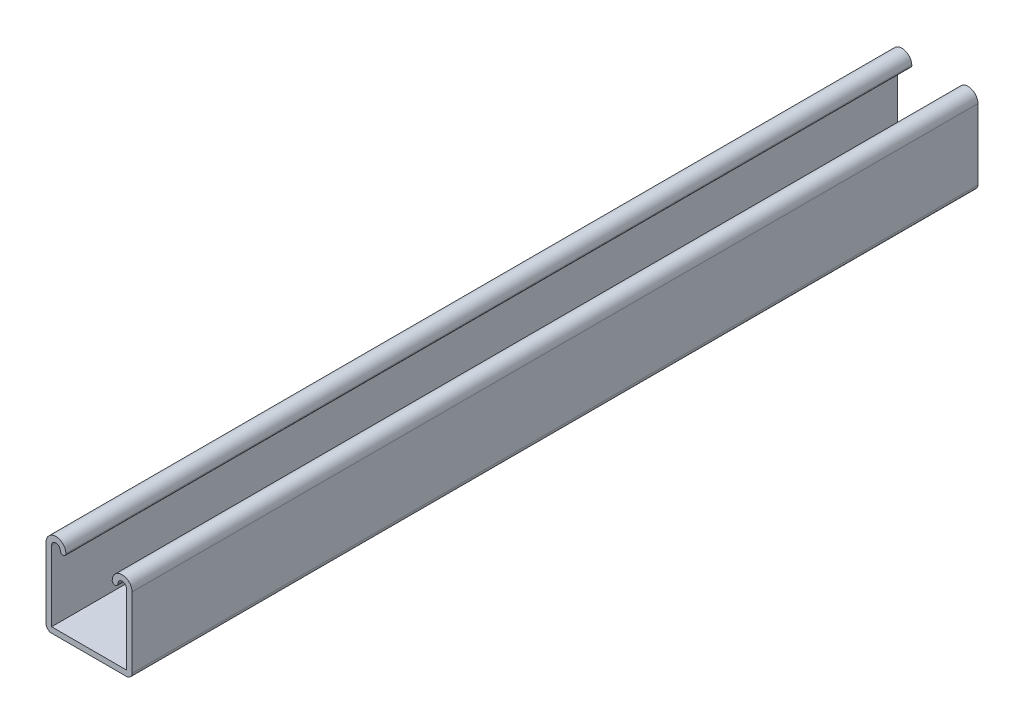
ISO-10303-21;
HEADER;
FILE_DESCRIPTION(('STEP AP214'),'2;1');
FILE_NAME('part.step','',(''),(''),'','','');
FILE_SCHEMA(('AUTOMOTIVE_DESIGN { 1 0 10303 214 1 1 1 1 }'));
ENDSEC;
DATA;
#1=APPLICATION_CONTEXT('core data for automotive mechanical design processes');
#2=APPLICATION_PROTOCOL_DEFINITION('international standard','automotive_design',2000,#1);
#3=PRODUCT_CONTEXT('',#1,'mechanical');
#4=PRODUCT('Part','Part','',(#3));
#5=PRODUCT_RELATED_PRODUCT_CATEGORY('part','',(#4));
#6=PRODUCT_DEFINITION_FORMATION('','',#4);
#7=PRODUCT_DEFINITION_CONTEXT('part definition',#1,'design');
#8=PRODUCT_DEFINITION('design','',#6,#7);
#9=PRODUCT_DEFINITION_SHAPE('','',#8);
#10=(LENGTH_UNIT() NAMED_UNIT(*) SI_UNIT(.MILLI.,.METRE.));
#11=(NAMED_UNIT(*) PLANE_ANGLE_UNIT() SI_UNIT($,.RADIAN.));
#12=(NAMED_UNIT(*) SI_UNIT($,.STERADIAN.) SOLID_ANGLE_UNIT());
#13=UNCERTAINTY_MEASURE_WITH_UNIT(LENGTH_MEASURE(1.E-05),#10,'distance_accuracy_value','');
#14=(GEOMETRIC_REPRESENTATION_CONTEXT(3) GLOBAL_UNCERTAINTY_ASSIGNED_CONTEXT((#13)) GLOBAL_UNIT_ASSIGNED_CONTEXT((#10,
#11,#12)) REPRESENTATION_CONTEXT('',''));
#15=CARTESIAN_POINT('',(0.,0.,0.));
#16=DIRECTION('',(0.,0.,1.));
#17=DIRECTION('',(1.,0.,0.));
#18=AXIS2_PLACEMENT_3D('',#15,#16,#17);
#19=CARTESIAN_POINT('',(0.,2.6924,406.4));
#20=DIRECTION('',(0.,0.,-1.));
#21=DIRECTION('',(-1.,0.,0.));
#22=AXIS2_PLACEMENT_3D('',#19,#20,#21);
#23=CYLINDRICAL_SURFACE('',#22,2.6924);
#24=CARTESIAN_POINT('',(0.,2.6924,0.));
#25=DIRECTION('',(0.,0.,1.));
#26=DIRECTION('',(-1.,0.,0.));
#27=AXIS2_PLACEMENT_3D('',#24,#25,#26);
#28=CIRCLE('',#27,2.6924);
#29=CARTESIAN_POINT('',(-2.6924,2.6924,0.));
#30=VERTEX_POINT('',#29);
#31=CARTESIAN_POINT('',(0.,0.,0.));
#32=VERTEX_POINT('',#31);
#33=EDGE_CURVE('E167',#30,#32,#28,.T.);
#34=ORIENTED_EDGE('',*,*,#33,.T.);
#35=DIRECTION('',(0.,0.,-1.));
#36=VECTOR('',#35,1.);
#37=CARTESIAN_POINT('',(0.,0.,406.4));
#38=LINE('',#37,#36);
#39=CARTESIAN_POINT('',(0.,0.,406.4));
#40=VERTEX_POINT('',#39);
#41=EDGE_CURVE('E11',#40,#32,#38,.T.);
#42=ORIENTED_EDGE('',*,*,#41,.F.);
#43=CARTESIAN_POINT('',(0.,2.6924,406.4));
#44=DIRECTION('',(0.,0.,1.));
#45=DIRECTION('',(-1.,0.,0.));
#46=AXIS2_PLACEMENT_3D('',#43,#44,#45);
#47=CIRCLE('',#46,2.6924);
#48=CARTESIAN_POINT('',(-2.6924,2.6924,406.4));
#49=VERTEX_POINT('',#48);
#50=EDGE_CURVE('E194',#49,#40,#47,.T.);
#51=ORIENTED_EDGE('',*,*,#50,.F.);
#52=DIRECTION('',(0.,0.,-1.));
#53=VECTOR('',#52,1.);
#54=CARTESIAN_POINT('',(-2.6924,2.6924,406.4));
#55=LINE('',#54,#53);
#56=EDGE_CURVE('E163',#49,#30,#55,.T.);
#57=ORIENTED_EDGE('',*,*,#56,.T.);
#58=EDGE_LOOP('',(#34,#42,#51,#57));
#59=FACE_BOUND('',#58,.T.);
#60=ADVANCED_FACE('F33',(#59),#23,.T.);
#61=CARTESIAN_POINT('',(0.,0.,406.4));
#62=DIRECTION('',(0.,1.,0.));
#63=DIRECTION('',(0.,0.,1.));
#64=AXIS2_PLACEMENT_3D('',#61,#62,#63);
#65=PLANE('',#64);
#66=CARTESIAN_POINT('',(17.99,0.,285.75));
#67=DIRECTION('',(0.,-1.,0.));
#68=DIRECTION('',(0.,0.,1.));
#69=AXIS2_PLACEMENT_3D('',#66,#67,#68);
#70=CIRCLE('',#69,7.11199999999999);
#71=CARTESIAN_POINT('',(17.99,0.,292.862));
#72=VERTEX_POINT('',#71);
#73=EDGE_CURVE('E232',#72,#72,#70,.T.);
#74=ORIENTED_EDGE('',*,*,#73,.F.);
#75=EDGE_LOOP('',(#74));
#76=FACE_BOUND('',#75,.T.);
#77=CARTESIAN_POINT('',(17.99,0.,120.65));
#78=DIRECTION('',(0.,-1.,0.));
#79=DIRECTION('',(0.,0.,-1.));
#80=AXIS2_PLACEMENT_3D('',#77,#78,#79);
#81=CIRCLE('',#80,7.112);
#82=CARTESIAN_POINT('',(17.99,0.,113.538));
#83=VERTEX_POINT('',#82);
#84=EDGE_CURVE('E224',#83,#83,#81,.T.);
#85=ORIENTED_EDGE('',*,*,#84,.F.);
#86=EDGE_LOOP('',(#85));
#87=FACE_BOUND('',#86,.T.);
#88=DIRECTION('',(1.,0.,0.));
#89=VECTOR('',#88,1.);
#90=CARTESIAN_POINT('',(0.,0.,0.));
#91=LINE('',#90,#89);
#92=CARTESIAN_POINT('',(35.98,0.,0.));
#93=VERTEX_POINT('',#92);
#94=EDGE_CURVE('E170',#32,#93,#91,.T.);
#95=ORIENTED_EDGE('',*,*,#94,.T.);
#96=DIRECTION('',(0.,0.,-1.));
#97=VECTOR('',#96,1.);
#98=CARTESIAN_POINT('',(35.98,0.,406.4));
#99=LINE('',#98,#97);
#100=CARTESIAN_POINT('',(35.98,0.,406.4));
#101=VERTEX_POINT('',#100);
#102=EDGE_CURVE('E42',#101,#93,#99,.T.);
#103=ORIENTED_EDGE('',*,*,#102,.F.);
#104=DIRECTION('',(1.,0.,0.));
#105=VECTOR('',#104,1.);
#106=CARTESIAN_POINT('',(0.,0.,406.4));
#107=LINE('',#106,#105);
#108=EDGE_CURVE('E112',#40,#101,#107,.T.);
#109=ORIENTED_EDGE('',*,*,#108,.F.);
#110=ORIENTED_EDGE('',*,*,#41,.T.);
#111=EDGE_LOOP('',(#95,#103,#109,#110));
#112=FACE_BOUND('',#111,.T.);
#113=ADVANCED_FACE('F280',(#76,#87,#112),#65,.F.);
#114=CARTESIAN_POINT('',(35.98,2.6924,406.4));
#115=DIRECTION('',(0.,0.,-1.));
#116=DIRECTION('',(-1.,0.,0.));
#117=AXIS2_PLACEMENT_3D('',#114,#115,#116);
#118=CYLINDRICAL_SURFACE('',#117,2.6924);
#119=CARTESIAN_POINT('',(35.98,2.6924,0.));
#120=DIRECTION('',(0.,0.,1.));
#121=DIRECTION('',(1.,0.,0.));
#122=AXIS2_PLACEMENT_3D('',#119,#120,#121);
#123=CIRCLE('',#122,2.6924);
#124=CARTESIAN_POINT('',(38.6724,2.6924,0.));
#125=VERTEX_POINT('',#124);
#126=EDGE_CURVE('E173',#93,#125,#123,.T.);
#127=ORIENTED_EDGE('',*,*,#126,.T.);
#128=DIRECTION('',(0.,0.,-1.));
#129=VECTOR('',#128,1.);
#130=CARTESIAN_POINT('',(38.6724,2.6924,406.4));
#131=LINE('',#130,#129);
#132=CARTESIAN_POINT('',(38.6724,2.6924,406.4));
#133=VERTEX_POINT('',#132);
#134=EDGE_CURVE('E219',#133,#125,#131,.T.);
#135=ORIENTED_EDGE('',*,*,#134,.F.);
#136=CARTESIAN_POINT('',(35.98,2.6924,406.4));
#137=DIRECTION('',(0.,0.,1.));
#138=DIRECTION('',(1.,0.,0.));
#139=AXIS2_PLACEMENT_3D('',#136,#137,#138);
#140=CIRCLE('',#139,2.6924);
#141=EDGE_CURVE('E237',#101,#133,#140,.T.);
#142=ORIENTED_EDGE('',*,*,#141,.F.);
#143=ORIENTED_EDGE('',*,*,#102,.T.);
#144=EDGE_LOOP('',(#127,#135,#142,#143));
#145=FACE_BOUND('',#144,.T.);
#146=ADVANCED_FACE('F284',(#145),#118,.T.);
#147=CARTESIAN_POINT('',(38.6724,2.6924,406.4));
#148=DIRECTION('',(-1.,0.,0.));
#149=DIRECTION('',(0.,0.,1.));
#150=AXIS2_PLACEMENT_3D('',#147,#148,#149);
#151=PLANE('',#150);
#152=DIRECTION('',(0.,1.,0.));
#153=VECTOR('',#152,1.);
#154=CARTESIAN_POINT('',(38.6724,2.6924,0.));
#155=LINE('',#154,#153);
#156=CARTESIAN_POINT('',(38.6724,36.5252,0.));
#157=VERTEX_POINT('',#156);
#158=EDGE_CURVE('E175',#125,#157,#155,.T.);
#159=ORIENTED_EDGE('',*,*,#158,.T.);
#160=DIRECTION('',(0.,0.,-1.));
#161=VECTOR('',#160,1.);
#162=CARTESIAN_POINT('',(38.6724,36.5252,406.4));
#163=LINE('',#162,#161);
#164=CARTESIAN_POINT('',(38.6724,36.5252,406.4));
#165=VERTEX_POINT('',#164);
#166=EDGE_CURVE('E216',#165,#157,#163,.T.);
#167=ORIENTED_EDGE('',*,*,#166,.F.);
#168=DIRECTION('',(0.,1.,0.));
#169=VECTOR('',#168,1.);
#170=CARTESIAN_POINT('',(38.6724,2.6924,406.4));
#171=LINE('',#170,#169);
#172=EDGE_CURVE('E239',#133,#165,#171,.T.);
#173=ORIENTED_EDGE('',*,*,#172,.F.);
#174=ORIENTED_EDGE('',*,*,#134,.T.);
#175=EDGE_LOOP('',(#159,#167,#173,#174));
#176=FACE_BOUND('',#175,.T.);
#177=ADVANCED_FACE('F289',(#176),#151,.F.);
#178=CARTESIAN_POINT('',(33.8972,36.5252,406.4));
#179=DIRECTION('',(0.,0.,-1.));
#180=DIRECTION('',(-1.,0.,0.));
#181=AXIS2_PLACEMENT_3D('',#178,#179,#180);
#182=CYLINDRICAL_SURFACE('',#181,4.7752);
#183=CARTESIAN_POINT('',(33.8972,36.5252,0.));
#184=DIRECTION('',(0.,0.,1.));
#185=DIRECTION('',(1.,0.,0.));
#186=AXIS2_PLACEMENT_3D('',#183,#184,#185);
#187=CIRCLE('',#186,4.7752);
#188=CARTESIAN_POINT('',(29.122,36.5252,0.));
#189=VERTEX_POINT('',#188);
#190=EDGE_CURVE('E177',#157,#189,#187,.T.);
#191=ORIENTED_EDGE('',*,*,#190,.T.);
#192=DIRECTION('',(0.,0.,-1.));
#193=VECTOR('',#192,1.);
#194=CARTESIAN_POINT('',(29.122,36.5252,406.4));
#195=LINE('',#194,#193);
#196=CARTESIAN_POINT('',(29.122,36.5252,406.4));
#197=VERTEX_POINT('',#196);
#198=EDGE_CURVE('E213',#197,#189,#195,.T.);
#199=ORIENTED_EDGE('',*,*,#198,.F.);
#200=CARTESIAN_POINT('',(33.8972,36.5252,406.4));
#201=DIRECTION('',(0.,0.,1.));
#202=DIRECTION('',(1.,0.,0.));
#203=AXIS2_PLACEMENT_3D('',#200,#201,#202);
#204=CIRCLE('',#203,4.7752);
#205=EDGE_CURVE('E241',#165,#197,#204,.T.);
#206=ORIENTED_EDGE('',*,*,#205,.F.);
#207=ORIENTED_EDGE('',*,*,#166,.T.);
#208=EDGE_LOOP('',(#191,#199,#206,#207));
#209=FACE_BOUND('',#208,.T.);
#210=ADVANCED_FACE('F297',(#209),#182,.T.);
#211=CARTESIAN_POINT('',(30.4682,36.5252,406.4));
#212=DIRECTION('',(0.,0.,-1.));
#213=DIRECTION('',(-1.,0.,0.));
#214=AXIS2_PLACEMENT_3D('',#211,#212,#213);
#215=CYLINDRICAL_SURFACE('',#214,1.3462);
#216=CARTESIAN_POINT('',(30.4682,36.5252,0.));
#217=DIRECTION('',(0.,0.,1.));
#218=DIRECTION('',(1.,0.,0.));
#219=AXIS2_PLACEMENT_3D('',#216,#217,#218);
#220=CIRCLE('',#219,1.3462);
#221=CARTESIAN_POINT('',(31.8144,36.5252,0.));
#222=VERTEX_POINT('',#221);
#223=EDGE_CURVE('E179',#189,#222,#220,.T.);
#224=ORIENTED_EDGE('',*,*,#223,.T.);
#225=DIRECTION('',(0.,0.,-1.));
#226=VECTOR('',#225,1.);
#227=CARTESIAN_POINT('',(31.8144,36.5252,406.4));
#228=LINE('',#227,#226);
#229=CARTESIAN_POINT('',(31.8144,36.5252,406.4));
#230=VERTEX_POINT('',#229);
#231=EDGE_CURVE('E210',#230,#222,#228,.T.);
#232=ORIENTED_EDGE('',*,*,#231,.F.);
#233=CARTESIAN_POINT('',(30.4682,36.5252,406.4));
#234=DIRECTION('',(0.,0.,1.));
#235=DIRECTION('',(1.,0.,0.));
#236=AXIS2_PLACEMENT_3D('',#233,#234,#235);
#237=CIRCLE('',#236,1.3462);
#238=EDGE_CURVE('E243',#197,#230,#237,.T.);
#239=ORIENTED_EDGE('',*,*,#238,.F.);
#240=ORIENTED_EDGE('',*,*,#198,.T.);
#241=EDGE_LOOP('',(#224,#232,#239,#240));
#242=FACE_BOUND('',#241,.T.);
#243=ADVANCED_FACE('F301',(#242),#215,.T.);
#244=CARTESIAN_POINT('',(33.8972,36.5252,406.4));
#245=DIRECTION('',(0.,0.,-1.));
#246=DIRECTION('',(-1.,0.,0.));
#247=AXIS2_PLACEMENT_3D('',#244,#245,#246);
#248=CYLINDRICAL_SURFACE('',#247,2.0828);
#249=CARTESIAN_POINT('',(33.8972,36.5252,0.));
#250=DIRECTION('',(0.,0.,-1.));
#251=DIRECTION('',(1.,0.,0.));
#252=AXIS2_PLACEMENT_3D('',#249,#250,#251);
#253=CIRCLE('',#252,2.0828);
#254=CARTESIAN_POINT('',(35.98,36.5252,0.));
#255=VERTEX_POINT('',#254);
#256=EDGE_CURVE('E181',#222,#255,#253,.T.);
#257=ORIENTED_EDGE('',*,*,#256,.T.);
#258=DIRECTION('',(0.,0.,-1.));
#259=VECTOR('',#258,1.);
#260=CARTESIAN_POINT('',(35.98,36.5252,406.4));
#261=LINE('',#260,#259);
#262=CARTESIAN_POINT('',(35.98,36.5252,406.4));
#263=VERTEX_POINT('',#262);
#264=EDGE_CURVE('E207',#263,#255,#261,.T.);
#265=ORIENTED_EDGE('',*,*,#264,.F.);
#266=CARTESIAN_POINT('',(33.8972,36.5252,406.4));
#267=DIRECTION('',(0.,0.,-1.));
#268=DIRECTION('',(1.,0.,0.));
#269=AXIS2_PLACEMENT_3D('',#266,#267,#268);
#270=CIRCLE('',#269,2.0828);
#271=EDGE_CURVE('E245',#230,#263,#270,.T.);
#272=ORIENTED_EDGE('',*,*,#271,.F.);
#273=ORIENTED_EDGE('',*,*,#231,.T.);
#274=EDGE_LOOP('',(#257,#265,#272,#273));
#275=FACE_BOUND('',#274,.T.);
#276=ADVANCED_FACE('F305',(#275),#248,.F.);
#277=CARTESIAN_POINT('',(35.98,2.6924,406.4));
#278=DIRECTION('',(1.,0.,0.));
#279=DIRECTION('',(0.,0.,-1.));
#280=AXIS2_PLACEMENT_3D('',#277,#278,#279);
#281=PLANE('',#280);
#282=DIRECTION('',(0.,-1.,0.));
#283=VECTOR('',#282,1.);
#284=CARTESIAN_POINT('',(35.98,2.6924,0.));
#285=LINE('',#284,#283);
#286=CARTESIAN_POINT('',(35.98,2.6924,0.));
#287=VERTEX_POINT('',#286);
#288=EDGE_CURVE('E183',#255,#287,#285,.T.);
#289=ORIENTED_EDGE('',*,*,#288,.T.);
#290=DIRECTION('',(0.,0.,-1.));
#291=VECTOR('',#290,1.);
#292=CARTESIAN_POINT('',(35.98,2.6924,406.4));
#293=LINE('',#292,#291);
#294=CARTESIAN_POINT('',(35.98,2.6924,406.4));
#295=VERTEX_POINT('',#294);
#296=EDGE_CURVE('E204',#295,#287,#293,.T.);
#297=ORIENTED_EDGE('',*,*,#296,.F.);
#298=DIRECTION('',(0.,-1.,0.));
#299=VECTOR('',#298,1.);
#300=CARTESIAN_POINT('',(35.98,2.6924,406.4));
#301=LINE('',#300,#299);
#302=EDGE_CURVE('E247',#263,#295,#301,.T.);
#303=ORIENTED_EDGE('',*,*,#302,.F.);
#304=ORIENTED_EDGE('',*,*,#264,.T.);
#305=EDGE_LOOP('',(#289,#297,#303,#304));
#306=FACE_BOUND('',#305,.T.);
#307=ADVANCED_FACE('F309',(#306),#281,.F.);
#308=CARTESIAN_POINT('',(35.98,2.6924,406.4));
#309=DIRECTION('',(0.,-1.,0.));
#310=DIRECTION('',(0.,0.,-1.));
#311=AXIS2_PLACEMENT_3D('',#308,#309,#310);
#312=PLANE('',#311);
#313=CARTESIAN_POINT('',(17.99,2.6924,285.75));
#314=DIRECTION('',(0.,-1.,0.));
#315=DIRECTION('',(0.,0.,-1.));
#316=AXIS2_PLACEMENT_3D('',#313,#314,#315);
#317=CIRCLE('',#316,7.11199999999999);
#318=CARTESIAN_POINT('',(17.99,2.6924,278.638));
#319=VERTEX_POINT('',#318);
#320=EDGE_CURVE('E36',#319,#319,#317,.T.);
#321=ORIENTED_EDGE('',*,*,#320,.T.);
#322=EDGE_LOOP('',(#321));
#323=FACE_BOUND('',#322,.T.);
#324=CARTESIAN_POINT('',(17.99,2.6924,120.65));
#325=DIRECTION('',(0.,-1.,0.));
#326=DIRECTION('',(0.,0.,-1.));
#327=AXIS2_PLACEMENT_3D('',#324,#325,#326);
#328=CIRCLE('',#327,7.112);
#329=CARTESIAN_POINT('',(17.99,2.6924,113.538));
#330=VERTEX_POINT('',#329);
#331=EDGE_CURVE('E171',#330,#330,#328,.T.);
#332=ORIENTED_EDGE('',*,*,#331,.T.);
#333=EDGE_LOOP('',(#332));
#334=FACE_BOUND('',#333,.T.);
#335=DIRECTION('',(-1.,0.,0.));
#336=VECTOR('',#335,1.);
#337=CARTESIAN_POINT('',(35.98,2.6924,0.));
#338=LINE('',#337,#336);
#339=CARTESIAN_POINT('',(0.,2.6924,0.));
#340=VERTEX_POINT('',#339);
#341=EDGE_CURVE('E185',#287,#340,#338,.T.);
#342=ORIENTED_EDGE('',*,*,#341,.T.);
#343=DIRECTION('',(0.,0.,-1.));
#344=VECTOR('',#343,1.);
#345=CARTESIAN_POINT('',(0.,2.6924,406.4));
#346=LINE('',#345,#344);
#347=CARTESIAN_POINT('',(0.,2.6924,406.4));
#348=VERTEX_POINT('',#347);
#349=EDGE_CURVE('E201',#348,#340,#346,.T.);
#350=ORIENTED_EDGE('',*,*,#349,.F.);
#351=DIRECTION('',(-1.,0.,0.));
#352=VECTOR('',#351,1.);
#353=CARTESIAN_POINT('',(35.98,2.6924,406.4));
#354=LINE('',#353,#352);
#355=EDGE_CURVE('E249',#295,#348,#354,.T.);
#356=ORIENTED_EDGE('',*,*,#355,.F.);
#357=ORIENTED_EDGE('',*,*,#296,.T.);
#358=EDGE_LOOP('',(#342,#350,#356,#357));
#359=FACE_BOUND('',#358,.T.);
#360=ADVANCED_FACE('F313',(#323,#334,#359),#312,.F.);
#361=CARTESIAN_POINT('',(0.,2.6924,406.4));
#362=DIRECTION('',(-1.,0.,0.));
#363=DIRECTION('',(0.,0.,1.));
#364=AXIS2_PLACEMENT_3D('',#361,#362,#363);
#365=PLANE('',#364);
#366=DIRECTION('',(0.,1.,0.));
#367=VECTOR('',#366,1.);
#368=CARTESIAN_POINT('',(0.,2.6924,0.));
#369=LINE('',#368,#367);
#370=CARTESIAN_POINT('',(0.,36.5252,0.));
#371=VERTEX_POINT('',#370);
#372=EDGE_CURVE('E187',#340,#371,#369,.T.);
#373=ORIENTED_EDGE('',*,*,#372,.T.);
#374=DIRECTION('',(0.,0.,-1.));
#375=VECTOR('',#374,1.);
#376=CARTESIAN_POINT('',(0.,36.5252,406.4));
#377=LINE('',#376,#375);
#378=CARTESIAN_POINT('',(0.,36.5252,406.4));
#379=VERTEX_POINT('',#378);
#380=EDGE_CURVE('E198',#379,#371,#377,.T.);
#381=ORIENTED_EDGE('',*,*,#380,.F.);
#382=DIRECTION('',(0.,1.,0.));
#383=VECTOR('',#382,1.);
#384=CARTESIAN_POINT('',(0.,2.6924,406.4));
#385=LINE('',#384,#383);
#386=EDGE_CURVE('E251',#348,#379,#385,.T.);
#387=ORIENTED_EDGE('',*,*,#386,.F.);
#388=ORIENTED_EDGE('',*,*,#349,.T.);
#389=EDGE_LOOP('',(#373,#381,#387,#388));
#390=FACE_BOUND('',#389,.T.);
#391=ADVANCED_FACE('F257',(#390),#365,.F.);
#392=CARTESIAN_POINT('',(2.0828,36.5252,406.4));
#393=DIRECTION('',(0.,0.,-1.));
#394=DIRECTION('',(-1.,0.,0.));
#395=AXIS2_PLACEMENT_3D('',#392,#393,#394);
#396=CYLINDRICAL_SURFACE('',#395,2.0828);
#397=CARTESIAN_POINT('',(2.0828,36.5252,0.));
#398=DIRECTION('',(0.,0.,-1.));
#399=DIRECTION('',(-1.,0.,0.));
#400=AXIS2_PLACEMENT_3D('',#397,#398,#399);
#401=CIRCLE('',#400,2.0828);
#402=CARTESIAN_POINT('',(4.16560000000001,36.5252,0.));
#403=VERTEX_POINT('',#402);
#404=EDGE_CURVE('E189',#371,#403,#401,.T.);
#405=ORIENTED_EDGE('',*,*,#404,.T.);
#406=DIRECTION('',(0.,0.,-1.));
#407=VECTOR('',#406,1.);
#408=CARTESIAN_POINT('',(4.16560000000001,36.5252,406.4));
#409=LINE('',#408,#407);
#410=CARTESIAN_POINT('',(4.16560000000001,36.5252,406.4));
#411=VERTEX_POINT('',#410);
#412=EDGE_CURVE('E158',#411,#403,#409,.T.);
#413=ORIENTED_EDGE('',*,*,#412,.F.);
#414=CARTESIAN_POINT('',(2.0828,36.5252,406.4));
#415=DIRECTION('',(0.,0.,-1.));
#416=DIRECTION('',(-1.,0.,0.));
#417=AXIS2_PLACEMENT_3D('',#414,#415,#416);
#418=CIRCLE('',#417,2.0828);
#419=EDGE_CURVE('E149',#379,#411,#418,.T.);
#420=ORIENTED_EDGE('',*,*,#419,.F.);
#421=ORIENTED_EDGE('',*,*,#380,.T.);
#422=EDGE_LOOP('',(#405,#413,#420,#421));
#423=FACE_BOUND('',#422,.T.);
#424=ADVANCED_FACE('F261',(#423),#396,.F.);
#425=CARTESIAN_POINT('',(5.5118,36.5252,406.4));
#426=DIRECTION('',(0.,0.,-1.));
#427=DIRECTION('',(-1.,0.,0.));
#428=AXIS2_PLACEMENT_3D('',#425,#426,#427);
#429=CYLINDRICAL_SURFACE('',#428,1.3462);
#430=CARTESIAN_POINT('',(5.5118,36.5252,0.));
#431=DIRECTION('',(0.,0.,1.));
#432=DIRECTION('',(-1.,0.,0.));
#433=AXIS2_PLACEMENT_3D('',#430,#431,#432);
#434=CIRCLE('',#433,1.3462);
#435=CARTESIAN_POINT('',(6.858,36.5252,0.));
#436=VERTEX_POINT('',#435);
#437=EDGE_CURVE('E157',#403,#436,#434,.T.);
#438=ORIENTED_EDGE('',*,*,#437,.T.);
#439=DIRECTION('',(0.,0.,-1.));
#440=VECTOR('',#439,1.);
#441=CARTESIAN_POINT('',(6.858,36.5252,406.4));
#442=LINE('',#441,#440);
#443=CARTESIAN_POINT('',(6.858,36.5252,406.4));
#444=VERTEX_POINT('',#443);
#445=EDGE_CURVE('E154',#444,#436,#442,.T.);
#446=ORIENTED_EDGE('',*,*,#445,.F.);
#447=CARTESIAN_POINT('',(5.5118,36.5252,406.4));
#448=DIRECTION('',(0.,0.,1.));
#449=DIRECTION('',(-1.,0.,0.));
#450=AXIS2_PLACEMENT_3D('',#447,#448,#449);
#451=CIRCLE('',#450,1.3462);
#452=EDGE_CURVE('E143',#411,#444,#451,.T.);
#453=ORIENTED_EDGE('',*,*,#452,.F.);
#454=ORIENTED_EDGE('',*,*,#412,.T.);
#455=EDGE_LOOP('',(#438,#446,#453,#454));
#456=FACE_BOUND('',#455,.T.);
#457=ADVANCED_FACE('F155',(#456),#429,.T.);
#458=CARTESIAN_POINT('',(2.0828,36.5252,406.4));
#459=DIRECTION('',(0.,0.,-1.));
#460=DIRECTION('',(-1.,0.,0.));
#461=AXIS2_PLACEMENT_3D('',#458,#459,#460);
#462=CYLINDRICAL_SURFACE('',#461,4.7752);
#463=CARTESIAN_POINT('',(2.0828,36.5252,0.));
#464=DIRECTION('',(0.,0.,1.));
#465=DIRECTION('',(-1.,0.,0.));
#466=AXIS2_PLACEMENT_3D('',#463,#464,#465);
#467=CIRCLE('',#466,4.7752);
#468=CARTESIAN_POINT('',(-2.6924,36.5252,0.));
#469=VERTEX_POINT('',#468);
#470=EDGE_CURVE('E98',#436,#469,#467,.T.);
#471=ORIENTED_EDGE('',*,*,#470,.T.);
#472=DIRECTION('',(0.,0.,-1.));
#473=VECTOR('',#472,1.);
#474=CARTESIAN_POINT('',(-2.6924,36.5252,406.4));
#475=LINE('',#474,#473);
#476=CARTESIAN_POINT('',(-2.6924,36.5252,406.4));
#477=VERTEX_POINT('',#476);
#478=EDGE_CURVE('E159',#477,#469,#475,.T.);
#479=ORIENTED_EDGE('',*,*,#478,.F.);
#480=CARTESIAN_POINT('',(2.0828,36.5252,406.4));
#481=DIRECTION('',(0.,0.,1.));
#482=DIRECTION('',(-1.,0.,0.));
#483=AXIS2_PLACEMENT_3D('',#480,#481,#482);
#484=CIRCLE('',#483,4.7752);
#485=EDGE_CURVE('E147',#444,#477,#484,.T.);
#486=ORIENTED_EDGE('',*,*,#485,.F.);
#487=ORIENTED_EDGE('',*,*,#445,.T.);
#488=EDGE_LOOP('',(#471,#479,#486,#487));
#489=FACE_BOUND('',#488,.T.);
#490=ADVANCED_FACE('F161',(#489),#462,.T.);
#491=CARTESIAN_POINT('',(-2.6924,2.6924,406.4));
#492=DIRECTION('',(1.,0.,0.));
#493=DIRECTION('',(0.,0.,-1.));
#494=AXIS2_PLACEMENT_3D('',#491,#492,#493);
#495=PLANE('',#494);
#496=DIRECTION('',(0.,-1.,0.));
#497=VECTOR('',#496,1.);
#498=CARTESIAN_POINT('',(-2.6924,2.6924,0.));
#499=LINE('',#498,#497);
#500=EDGE_CURVE('E104',#469,#30,#499,.T.);
#501=ORIENTED_EDGE('',*,*,#500,.T.);
#502=ORIENTED_EDGE('',*,*,#56,.F.);
#503=DIRECTION('',(0.,-1.,0.));
#504=VECTOR('',#503,1.);
#505=CARTESIAN_POINT('',(-2.6924,2.6924,406.4));
#506=LINE('',#505,#504);
#507=EDGE_CURVE('E51',#477,#49,#506,.T.);
#508=ORIENTED_EDGE('',*,*,#507,.F.);
#509=ORIENTED_EDGE('',*,*,#478,.T.);
#510=EDGE_LOOP('',(#501,#502,#508,#509));
#511=FACE_BOUND('',#510,.T.);
#512=ADVANCED_FACE('F269',(#511),#495,.F.);
#513=CARTESIAN_POINT('',(0.,2.6924,406.4));
#514=DIRECTION('',(0.,0.,-1.));
#515=DIRECTION('',(-1.,0.,0.));
#516=AXIS2_PLACEMENT_3D('',#513,#514,#515);
#517=PLANE('',#516);
#518=ORIENTED_EDGE('',*,*,#50,.T.);
#519=ORIENTED_EDGE('',*,*,#108,.T.);
#520=ORIENTED_EDGE('',*,*,#141,.T.);
#521=ORIENTED_EDGE('',*,*,#172,.T.);
#522=ORIENTED_EDGE('',*,*,#205,.T.);
#523=ORIENTED_EDGE('',*,*,#238,.T.);
#524=ORIENTED_EDGE('',*,*,#271,.T.);
#525=ORIENTED_EDGE('',*,*,#302,.T.);
#526=ORIENTED_EDGE('',*,*,#355,.T.);
#527=ORIENTED_EDGE('',*,*,#386,.T.);
#528=ORIENTED_EDGE('',*,*,#419,.T.);
#529=ORIENTED_EDGE('',*,*,#452,.T.);
#530=ORIENTED_EDGE('',*,*,#485,.T.);
#531=ORIENTED_EDGE('',*,*,#507,.T.);
#532=EDGE_LOOP('',(#518,#519,#520,#521,#522,#523,#524,#525,#526,#527,#528,#529,#530,#531));
#533=FACE_BOUND('',#532,.T.);
#534=ADVANCED_FACE('F145',(#533),#517,.F.);
#535=CARTESIAN_POINT('',(0.,2.6924,0.));
#536=DIRECTION('',(0.,0.,-1.));
#537=DIRECTION('',(-1.,0.,0.));
#538=AXIS2_PLACEMENT_3D('',#535,#536,#537);
#539=PLANE('',#538);
#540=ORIENTED_EDGE('',*,*,#33,.F.);
#541=ORIENTED_EDGE('',*,*,#500,.F.);
#542=ORIENTED_EDGE('',*,*,#470,.F.);
#543=ORIENTED_EDGE('',*,*,#437,.F.);
#544=ORIENTED_EDGE('',*,*,#404,.F.);
#545=ORIENTED_EDGE('',*,*,#372,.F.);
#546=ORIENTED_EDGE('',*,*,#341,.F.);
#547=ORIENTED_EDGE('',*,*,#288,.F.);
#548=ORIENTED_EDGE('',*,*,#256,.F.);
#549=ORIENTED_EDGE('',*,*,#223,.F.);
#550=ORIENTED_EDGE('',*,*,#190,.F.);
#551=ORIENTED_EDGE('',*,*,#158,.F.);
#552=ORIENTED_EDGE('',*,*,#126,.F.);
#553=ORIENTED_EDGE('',*,*,#94,.F.);
#554=EDGE_LOOP('',(#540,#541,#542,#543,#544,#545,#546,#547,#548,#549,#550,#551,#552,#553));
#555=FACE_BOUND('',#554,.T.);
#556=ADVANCED_FACE('F264',(#555),#539,.T.);
#557=CARTESIAN_POINT('',(17.99,41.3004,120.65));
#558=DIRECTION('',(0.,-1.,0.));
#559=DIRECTION('',(0.,0.,-1.));
#560=AXIS2_PLACEMENT_3D('',#557,#558,#559);
#561=CYLINDRICAL_SURFACE('',#560,7.112);
#562=ORIENTED_EDGE('',*,*,#84,.T.);
#563=EDGE_LOOP('',(#562));
#564=FACE_BOUND('',#563,.T.);
#565=ORIENTED_EDGE('',*,*,#331,.F.);
#566=EDGE_LOOP('',(#565));
#567=FACE_BOUND('',#566,.T.);
#568=ADVANCED_FACE('F349',(#564,#567),#561,.F.);
#569=CARTESIAN_POINT('',(17.99,41.3004,285.75));
#570=DIRECTION('',(0.,-1.,0.));
#571=DIRECTION('',(0.,0.,-1.));
#572=AXIS2_PLACEMENT_3D('',#569,#570,#571);
#573=CYLINDRICAL_SURFACE('',#572,7.11199999999999);
#574=ORIENTED_EDGE('',*,*,#73,.T.);
#575=EDGE_LOOP('',(#574));
#576=FACE_BOUND('',#575,.T.);
#577=ORIENTED_EDGE('',*,*,#320,.F.);
#578=EDGE_LOOP('',(#577));
#579=FACE_BOUND('',#578,.T.);
#580=ADVANCED_FACE('F372',(#576,#579),#573,.F.);
#581=CLOSED_SHELL('',(#60,#113,#146,#177,#210,#243,#276,#307,#360,#391,#424,#457,#490,#512,#534,
#556,#568,#580));
#582=MANIFOLD_SOLID_BREP('B2',#581);
#583=ADVANCED_BREP_SHAPE_REPRESENTATION('',(#18,#582),#14);
#584=SHAPE_DEFINITION_REPRESENTATION(#9,#583);
ENDSEC;
END-ISO-10303-21;
